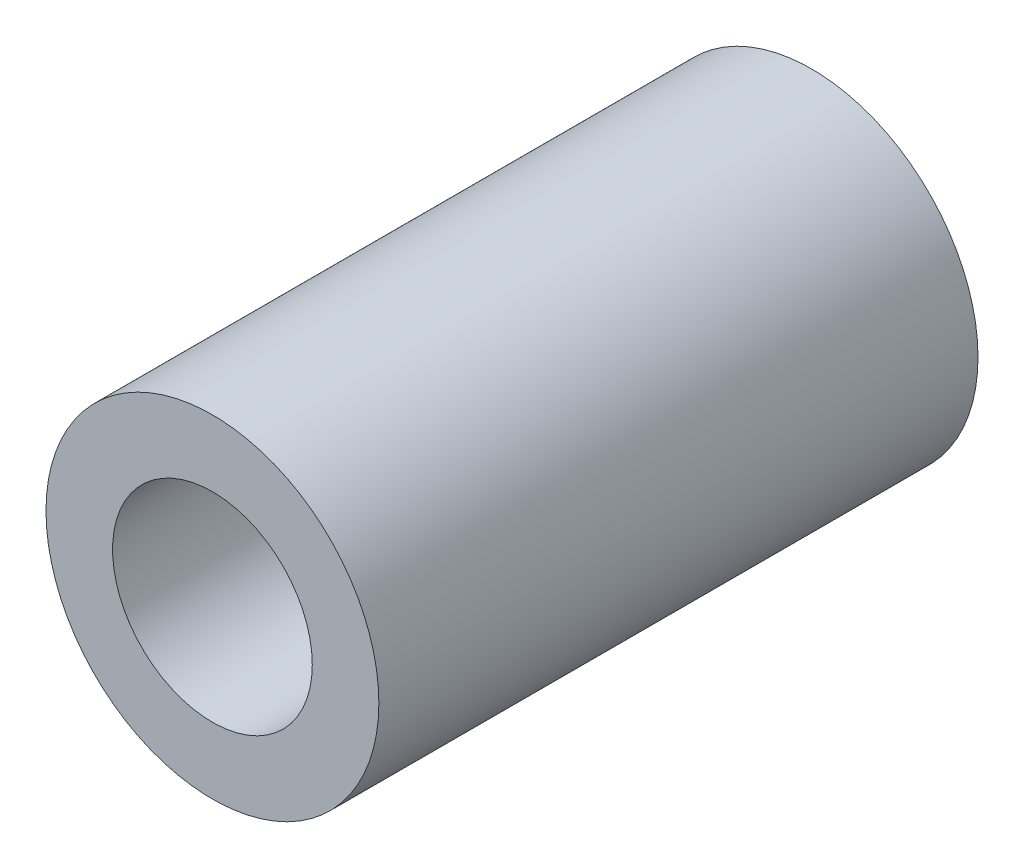
ISO-10303-21;
HEADER;
FILE_DESCRIPTION(('STEP AP214'),'2;1');
FILE_NAME('part.step','',(''),(''),'','','');
FILE_SCHEMA(('AUTOMOTIVE_DESIGN { 1 0 10303 214 1 1 1 1 }'));
ENDSEC;
DATA;
#1=APPLICATION_CONTEXT('core data for automotive mechanical design processes');
#2=APPLICATION_PROTOCOL_DEFINITION('international standard','automotive_design',2000,#1);
#3=PRODUCT_CONTEXT('',#1,'mechanical');
#4=PRODUCT('Part','Part','',(#3));
#5=PRODUCT_RELATED_PRODUCT_CATEGORY('part','',(#4));
#6=PRODUCT_DEFINITION_FORMATION('','',#4);
#7=PRODUCT_DEFINITION_CONTEXT('part definition',#1,'design');
#8=PRODUCT_DEFINITION('design','',#6,#7);
#9=PRODUCT_DEFINITION_SHAPE('','',#8);
#10=(LENGTH_UNIT() NAMED_UNIT(*) SI_UNIT(.MILLI.,.METRE.));
#11=(NAMED_UNIT(*) PLANE_ANGLE_UNIT() SI_UNIT($,.RADIAN.));
#12=(NAMED_UNIT(*) SI_UNIT($,.STERADIAN.) SOLID_ANGLE_UNIT());
#13=UNCERTAINTY_MEASURE_WITH_UNIT(LENGTH_MEASURE(1.E-05),#10,'distance_accuracy_value','');
#14=(GEOMETRIC_REPRESENTATION_CONTEXT(3) GLOBAL_UNCERTAINTY_ASSIGNED_CONTEXT((#13)) GLOBAL_UNIT_ASSIGNED_CONTEXT((#10,
#11,#12)) REPRESENTATION_CONTEXT('',''));
#15=CARTESIAN_POINT('',(0.,0.,0.));
#16=DIRECTION('',(0.,0.,1.));
#17=DIRECTION('',(1.,0.,0.));
#18=AXIS2_PLACEMENT_3D('',#15,#16,#17);
#19=CARTESIAN_POINT('',(0.,0.,18.));
#20=DIRECTION('',(0.,0.,1.));
#21=DIRECTION('',(1.,0.,0.));
#22=AXIS2_PLACEMENT_3D('',#19,#20,#21);
#23=PLANE('',#22);
#24=CARTESIAN_POINT('',(0.,0.,18.));
#25=DIRECTION('',(0.,0.,1.));
#26=DIRECTION('',(1.,0.,0.));
#27=AXIS2_PLACEMENT_3D('',#24,#25,#26);
#28=CIRCLE('',#27,5.);
#29=CARTESIAN_POINT('',(5.,0.,18.));
#30=VERTEX_POINT('',#29);
#31=EDGE_CURVE('E10',#30,#30,#28,.T.);
#32=ORIENTED_EDGE('',*,*,#31,.T.);
#33=EDGE_LOOP('',(#32));
#34=FACE_BOUND('',#33,.T.);
#35=CARTESIAN_POINT('',(0.,0.,18.));
#36=DIRECTION('',(0.,0.,1.));
#37=DIRECTION('',(1.,0.,0.));
#38=AXIS2_PLACEMENT_3D('',#35,#36,#37);
#39=CIRCLE('',#38,3.);
#40=CARTESIAN_POINT('',(3.,0.,18.));
#41=VERTEX_POINT('',#40);
#42=EDGE_CURVE('E46',#41,#41,#39,.T.);
#43=ORIENTED_EDGE('',*,*,#42,.F.);
#44=EDGE_LOOP('',(#43));
#45=FACE_BOUND('',#44,.T.);
#46=ADVANCED_FACE('F35',(#34,#45),#23,.T.);
#47=CARTESIAN_POINT('',(0.,0.,0.));
#48=DIRECTION('',(0.,0.,1.));
#49=DIRECTION('',(1.,0.,0.));
#50=AXIS2_PLACEMENT_3D('',#47,#48,#49);
#51=PLANE('',#50);
#52=CARTESIAN_POINT('',(0.,0.,0.));
#53=DIRECTION('',(0.,0.,1.));
#54=DIRECTION('',(1.,0.,0.));
#55=AXIS2_PLACEMENT_3D('',#52,#53,#54);
#56=CIRCLE('',#55,5.);
#57=CARTESIAN_POINT('',(5.,0.,0.));
#58=VERTEX_POINT('',#57);
#59=EDGE_CURVE('E39',#58,#58,#56,.T.);
#60=ORIENTED_EDGE('',*,*,#59,.F.);
#61=EDGE_LOOP('',(#60));
#62=FACE_BOUND('',#61,.T.);
#63=CARTESIAN_POINT('',(0.,0.,0.));
#64=DIRECTION('',(0.,0.,1.));
#65=DIRECTION('',(1.,0.,0.));
#66=AXIS2_PLACEMENT_3D('',#63,#64,#65);
#67=CIRCLE('',#66,3.);
#68=CARTESIAN_POINT('',(3.,0.,0.));
#69=VERTEX_POINT('',#68);
#70=EDGE_CURVE('E48',#69,#69,#67,.T.);
#71=ORIENTED_EDGE('',*,*,#70,.T.);
#72=EDGE_LOOP('',(#71));
#73=FACE_BOUND('',#72,.T.);
#74=ADVANCED_FACE('F58',(#62,#73),#51,.F.);
#75=CARTESIAN_POINT('',(0.,0.,18.));
#76=DIRECTION('',(0.,0.,-1.));
#77=DIRECTION('',(-1.,0.,0.));
#78=AXIS2_PLACEMENT_3D('',#75,#76,#77);
#79=CYLINDRICAL_SURFACE('',#78,5.);
#80=ORIENTED_EDGE('',*,*,#31,.F.);
#81=EDGE_LOOP('',(#80));
#82=FACE_BOUND('',#81,.T.);
#83=ORIENTED_EDGE('',*,*,#59,.T.);
#84=EDGE_LOOP('',(#83));
#85=FACE_BOUND('',#84,.T.);
#86=ADVANCED_FACE('F37',(#82,#85),#79,.T.);
#87=CARTESIAN_POINT('',(0.,0.,18.));
#88=DIRECTION('',(0.,0.,-1.));
#89=DIRECTION('',(-1.,0.,0.));
#90=AXIS2_PLACEMENT_3D('',#87,#88,#89);
#91=CYLINDRICAL_SURFACE('',#90,3.);
#92=ORIENTED_EDGE('',*,*,#42,.T.);
#93=EDGE_LOOP('',(#92));
#94=FACE_BOUND('',#93,.T.);
#95=ORIENTED_EDGE('',*,*,#70,.F.);
#96=EDGE_LOOP('',(#95));
#97=FACE_BOUND('',#96,.T.);
#98=ADVANCED_FACE('F54',(#94,#97),#91,.F.);
#99=CLOSED_SHELL('',(#46,#74,#86,#98));
#100=MANIFOLD_SOLID_BREP('B2',#99);
#101=ADVANCED_BREP_SHAPE_REPRESENTATION('',(#18,#100),#14);
#102=SHAPE_DEFINITION_REPRESENTATION(#9,#101);
ENDSEC;
END-ISO-10303-21;
